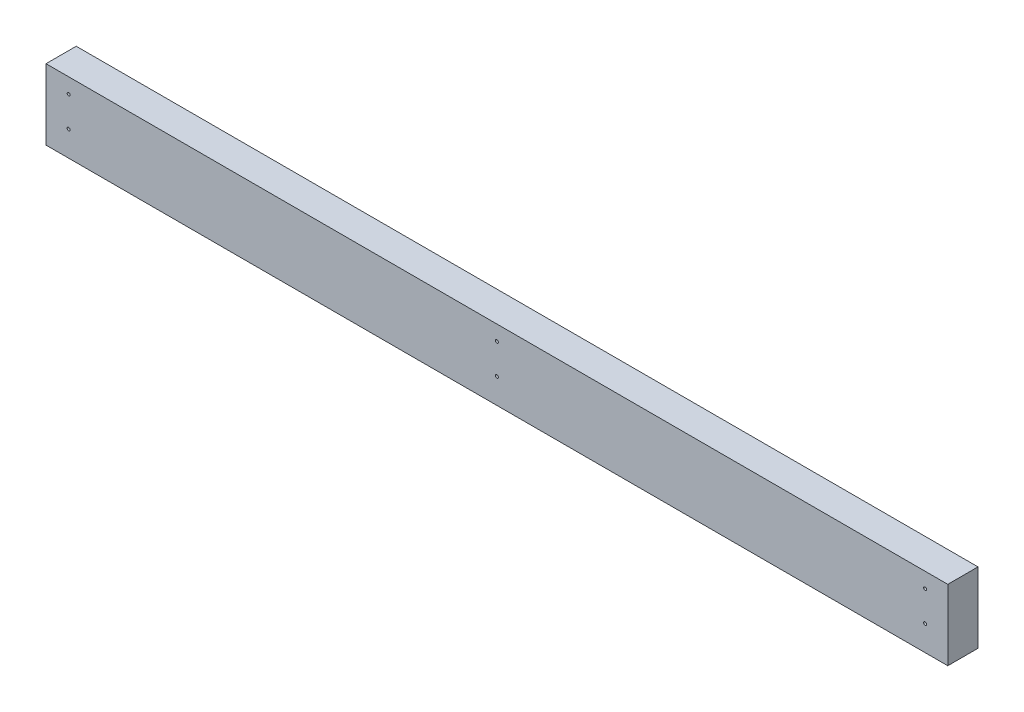
ISO-10303-21;
HEADER;
FILE_DESCRIPTION(('STEP AP214'),'2;1');
FILE_NAME('part.step','',(''),(''),'','','');
FILE_SCHEMA(('AUTOMOTIVE_DESIGN { 1 0 10303 214 1 1 1 1 }'));
ENDSEC;
DATA;
#1=APPLICATION_CONTEXT('core data for automotive mechanical design processes');
#2=APPLICATION_PROTOCOL_DEFINITION('international standard','automotive_design',2000,#1);
#3=PRODUCT_CONTEXT('',#1,'mechanical');
#4=PRODUCT('Part','Part','',(#3));
#5=PRODUCT_RELATED_PRODUCT_CATEGORY('part','',(#4));
#6=PRODUCT_DEFINITION_FORMATION('','',#4);
#7=PRODUCT_DEFINITION_CONTEXT('part definition',#1,'design');
#8=PRODUCT_DEFINITION('design','',#6,#7);
#9=PRODUCT_DEFINITION_SHAPE('','',#8);
#10=(LENGTH_UNIT() NAMED_UNIT(*) SI_UNIT(.MILLI.,.METRE.));
#11=(NAMED_UNIT(*) PLANE_ANGLE_UNIT() SI_UNIT($,.RADIAN.));
#12=(NAMED_UNIT(*) SI_UNIT($,.STERADIAN.) SOLID_ANGLE_UNIT());
#13=UNCERTAINTY_MEASURE_WITH_UNIT(LENGTH_MEASURE(1.E-05),#10,'distance_accuracy_value','');
#14=(GEOMETRIC_REPRESENTATION_CONTEXT(3) GLOBAL_UNCERTAINTY_ASSIGNED_CONTEXT((#13)) GLOBAL_UNIT_ASSIGNED_CONTEXT((#10,
#11,#12)) REPRESENTATION_CONTEXT('',''));
#15=CARTESIAN_POINT('',(0.,0.,0.));
#16=DIRECTION('',(0.,0.,1.));
#17=DIRECTION('',(1.,0.,0.));
#18=AXIS2_PLACEMENT_3D('',#15,#16,#17);
#19=CARTESIAN_POINT('',(-568.325,0.,1028.7));
#20=DIRECTION('',(0.,0.,1.));
#21=DIRECTION('',(1.,0.,0.));
#22=AXIS2_PLACEMENT_3D('',#19,#20,#21);
#23=PLANE('',#22);
#24=CARTESIAN_POINT('',(539.75,-431.8,1028.7));
#25=DIRECTION('',(0.,0.,-1.));
#26=DIRECTION('',(-1.,0.,0.));
#27=AXIS2_PLACEMENT_3D('',#24,#25,#26);
#28=CIRCLE('',#27,1.905);
#29=CARTESIAN_POINT('',(537.845,-431.8,1028.7));
#30=VERTEX_POINT('',#29);
#31=EDGE_CURVE('E95',#30,#30,#28,.F.);
#32=ORIENTED_EDGE('',*,*,#31,.T.);
#33=EDGE_LOOP('',(#32));
#34=FACE_BOUND('',#33,.T.);
#35=CARTESIAN_POINT('',(539.75,-469.9,1028.7));
#36=DIRECTION('',(0.,0.,-1.));
#37=DIRECTION('',(-1.,0.,0.));
#38=AXIS2_PLACEMENT_3D('',#35,#36,#37);
#39=CIRCLE('',#38,1.905);
#40=CARTESIAN_POINT('',(537.845,-469.9,1028.7));
#41=VERTEX_POINT('',#40);
#42=EDGE_CURVE('E99',#41,#41,#39,.F.);
#43=ORIENTED_EDGE('',*,*,#42,.T.);
#44=EDGE_LOOP('',(#43));
#45=FACE_BOUND('',#44,.T.);
#46=CARTESIAN_POINT('',(-539.75,-469.9,1028.7));
#47=DIRECTION('',(0.,0.,-1.));
#48=DIRECTION('',(-1.,0.,0.));
#49=AXIS2_PLACEMENT_3D('',#46,#47,#48);
#50=CIRCLE('',#49,1.905);
#51=CARTESIAN_POINT('',(-541.655,-469.9,1028.7));
#52=VERTEX_POINT('',#51);
#53=EDGE_CURVE('E102',#52,#52,#50,.F.);
#54=ORIENTED_EDGE('',*,*,#53,.T.);
#55=EDGE_LOOP('',(#54));
#56=FACE_BOUND('',#55,.T.);
#57=CARTESIAN_POINT('',(-539.75,-431.8,1028.7));
#58=DIRECTION('',(0.,0.,-1.));
#59=DIRECTION('',(-1.,0.,0.));
#60=AXIS2_PLACEMENT_3D('',#57,#58,#59);
#61=CIRCLE('',#60,1.905);
#62=CARTESIAN_POINT('',(-541.655,-431.8,1028.7));
#63=VERTEX_POINT('',#62);
#64=EDGE_CURVE('E105',#63,#63,#61,.F.);
#65=ORIENTED_EDGE('',*,*,#64,.T.);
#66=EDGE_LOOP('',(#65));
#67=FACE_BOUND('',#66,.T.);
#68=CARTESIAN_POINT('',(0.,-469.9,1028.7));
#69=DIRECTION('',(0.,0.,-1.));
#70=DIRECTION('',(-1.,0.,0.));
#71=AXIS2_PLACEMENT_3D('',#68,#69,#70);
#72=CIRCLE('',#71,1.905);
#73=CARTESIAN_POINT('',(-1.905,-469.9,1028.7));
#74=VERTEX_POINT('',#73);
#75=EDGE_CURVE('E107',#74,#74,#72,.F.);
#76=ORIENTED_EDGE('',*,*,#75,.T.);
#77=EDGE_LOOP('',(#76));
#78=FACE_BOUND('',#77,.T.);
#79=CARTESIAN_POINT('',(0.,-431.8,1028.7));
#80=DIRECTION('',(0.,0.,-1.));
#81=DIRECTION('',(-1.,0.,0.));
#82=AXIS2_PLACEMENT_3D('',#79,#80,#81);
#83=CIRCLE('',#82,1.905);
#84=CARTESIAN_POINT('',(-1.905,-431.8,1028.7));
#85=VERTEX_POINT('',#84);
#86=EDGE_CURVE('E19',#85,#85,#83,.F.);
#87=ORIENTED_EDGE('',*,*,#86,.T.);
#88=EDGE_LOOP('',(#87));
#89=FACE_BOUND('',#88,.T.);
#90=DIRECTION('',(1.,0.,0.));
#91=VECTOR('',#90,1.);
#92=CARTESIAN_POINT('',(568.325,-412.75,1028.7));
#93=LINE('',#92,#91);
#94=CARTESIAN_POINT('',(568.325,-412.75,1028.7));
#95=VERTEX_POINT('',#94);
#96=CARTESIAN_POINT('',(-568.325,-412.75,1028.7));
#97=VERTEX_POINT('',#96);
#98=EDGE_CURVE('E54',#95,#97,#93,.F.);
#99=ORIENTED_EDGE('',*,*,#98,.F.);
#100=DIRECTION('',(0.,1.,0.));
#101=VECTOR('',#100,1.);
#102=CARTESIAN_POINT('',(568.325,-501.65,1028.7));
#103=LINE('',#102,#101);
#104=CARTESIAN_POINT('',(568.325,-501.65,1028.7));
#105=VERTEX_POINT('',#104);
#106=EDGE_CURVE('E59',#105,#95,#103,.T.);
#107=ORIENTED_EDGE('',*,*,#106,.F.);
#108=DIRECTION('',(1.,0.,0.));
#109=VECTOR('',#108,1.);
#110=CARTESIAN_POINT('',(-568.325,-501.65,1028.7));
#111=LINE('',#110,#109);
#112=CARTESIAN_POINT('',(-568.325,-501.65,1028.7));
#113=VERTEX_POINT('',#112);
#114=EDGE_CURVE('E114',#113,#105,#111,.T.);
#115=ORIENTED_EDGE('',*,*,#114,.F.);
#116=DIRECTION('',(0.,1.,0.));
#117=VECTOR('',#116,1.);
#118=CARTESIAN_POINT('',(-568.325,-412.75,1028.7));
#119=LINE('',#118,#117);
#120=EDGE_CURVE('E69',#97,#113,#119,.F.);
#121=ORIENTED_EDGE('',*,*,#120,.F.);
#122=EDGE_LOOP('',(#99,#107,#115,#121));
#123=FACE_BOUND('',#122,.T.);
#124=ADVANCED_FACE('F16',(#34,#45,#56,#67,#78,#89,#123),#23,.F.);
#125=CARTESIAN_POINT('',(568.325,-501.65,1066.8));
#126=DIRECTION('',(1.,0.,0.));
#127=DIRECTION('',(0.,0.,-1.));
#128=AXIS2_PLACEMENT_3D('',#125,#126,#127);
#129=PLANE('',#128);
#130=DIRECTION('',(0.,0.,1.));
#131=VECTOR('',#130,1.);
#132=CARTESIAN_POINT('',(568.325,-412.75,1066.8));
#133=LINE('',#132,#131);
#134=CARTESIAN_POINT('',(568.325,-412.75,1066.8));
#135=VERTEX_POINT('',#134);
#136=EDGE_CURVE('E61',#135,#95,#133,.F.);
#137=ORIENTED_EDGE('',*,*,#136,.F.);
#138=DIRECTION('',(0.,1.,0.));
#139=VECTOR('',#138,1.);
#140=CARTESIAN_POINT('',(568.325,0.,1066.8));
#141=LINE('',#140,#139);
#142=CARTESIAN_POINT('',(568.325,-501.65,1066.8));
#143=VERTEX_POINT('',#142);
#144=EDGE_CURVE('E98',#143,#135,#141,.T.);
#145=ORIENTED_EDGE('',*,*,#144,.F.);
#146=DIRECTION('',(0.,0.,-1.));
#147=VECTOR('',#146,1.);
#148=CARTESIAN_POINT('',(568.325,-501.65,1066.8));
#149=LINE('',#148,#147);
#150=EDGE_CURVE('E64',#105,#143,#149,.F.);
#151=ORIENTED_EDGE('',*,*,#150,.F.);
#152=ORIENTED_EDGE('',*,*,#106,.T.);
#153=EDGE_LOOP('',(#137,#145,#151,#152));
#154=FACE_BOUND('',#153,.T.);
#155=ADVANCED_FACE('F60',(#154),#129,.T.);
#156=CARTESIAN_POINT('',(568.325,-412.75,1066.8));
#157=DIRECTION('',(0.,1.,0.));
#158=DIRECTION('',(0.,0.,1.));
#159=AXIS2_PLACEMENT_3D('',#156,#157,#158);
#160=PLANE('',#159);
#161=DIRECTION('',(0.,0.,1.));
#162=VECTOR('',#161,1.);
#163=CARTESIAN_POINT('',(-568.325,-412.75,1066.8));
#164=LINE('',#163,#162);
#165=CARTESIAN_POINT('',(-568.325,-412.75,1066.8));
#166=VERTEX_POINT('',#165);
#167=EDGE_CURVE('E71',#166,#97,#164,.F.);
#168=ORIENTED_EDGE('',*,*,#167,.F.);
#169=DIRECTION('',(1.,0.,0.));
#170=VECTOR('',#169,1.);
#171=CARTESIAN_POINT('',(-568.325,-412.75,1066.8));
#172=LINE('',#171,#170);
#173=EDGE_CURVE('E75',#135,#166,#172,.F.);
#174=ORIENTED_EDGE('',*,*,#173,.F.);
#175=ORIENTED_EDGE('',*,*,#136,.T.);
#176=ORIENTED_EDGE('',*,*,#98,.T.);
#177=EDGE_LOOP('',(#168,#174,#175,#176));
#178=FACE_BOUND('',#177,.T.);
#179=ADVANCED_FACE('F73',(#178),#160,.T.);
#180=CARTESIAN_POINT('',(-568.325,-412.75,1066.8));
#181=DIRECTION('',(-1.,0.,0.));
#182=DIRECTION('',(0.,0.,1.));
#183=AXIS2_PLACEMENT_3D('',#180,#181,#182);
#184=PLANE('',#183);
#185=DIRECTION('',(0.,0.,-1.));
#186=VECTOR('',#185,1.);
#187=CARTESIAN_POINT('',(-568.325,-501.65,1066.8));
#188=LINE('',#187,#186);
#189=CARTESIAN_POINT('',(-568.325,-501.65,1066.8));
#190=VERTEX_POINT('',#189);
#191=EDGE_CURVE('E34',#190,#113,#188,.T.);
#192=ORIENTED_EDGE('',*,*,#191,.F.);
#193=DIRECTION('',(0.,1.,0.));
#194=VECTOR('',#193,1.);
#195=CARTESIAN_POINT('',(-568.325,0.,1066.8));
#196=LINE('',#195,#194);
#197=EDGE_CURVE('E125',#166,#190,#196,.F.);
#198=ORIENTED_EDGE('',*,*,#197,.F.);
#199=ORIENTED_EDGE('',*,*,#167,.T.);
#200=ORIENTED_EDGE('',*,*,#120,.T.);
#201=EDGE_LOOP('',(#192,#198,#199,#200));
#202=FACE_BOUND('',#201,.T.);
#203=ADVANCED_FACE('F123',(#202),#184,.T.);
#204=CARTESIAN_POINT('',(-568.325,-501.65,1066.8));
#205=DIRECTION('',(0.,-1.,0.));
#206=DIRECTION('',(0.,0.,-1.));
#207=AXIS2_PLACEMENT_3D('',#204,#205,#206);
#208=PLANE('',#207);
#209=ORIENTED_EDGE('',*,*,#150,.T.);
#210=DIRECTION('',(1.,0.,0.));
#211=VECTOR('',#210,1.);
#212=CARTESIAN_POINT('',(-568.325,-501.65,1066.8));
#213=LINE('',#212,#211);
#214=EDGE_CURVE('E94',#190,#143,#213,.T.);
#215=ORIENTED_EDGE('',*,*,#214,.F.);
#216=ORIENTED_EDGE('',*,*,#191,.T.);
#217=ORIENTED_EDGE('',*,*,#114,.T.);
#218=EDGE_LOOP('',(#209,#215,#216,#217));
#219=FACE_BOUND('',#218,.T.);
#220=ADVANCED_FACE('F130',(#219),#208,.T.);
#221=CARTESIAN_POINT('',(0.,-431.8,1028.7));
#222=DIRECTION('',(0.,0.,-1.));
#223=DIRECTION('',(-1.,0.,0.));
#224=AXIS2_PLACEMENT_3D('',#221,#222,#223);
#225=CYLINDRICAL_SURFACE('',#224,1.905);
#226=ORIENTED_EDGE('',*,*,#86,.F.);
#227=EDGE_LOOP('',(#226));
#228=FACE_BOUND('',#227,.T.);
#229=CARTESIAN_POINT('',(0.,-431.8,1066.8));
#230=DIRECTION('',(0.,0.,-1.));
#231=DIRECTION('',(-1.,0.,0.));
#232=AXIS2_PLACEMENT_3D('',#229,#230,#231);
#233=CIRCLE('',#232,1.905);
#234=CARTESIAN_POINT('',(-1.905,-431.8,1066.8));
#235=VERTEX_POINT('',#234);
#236=EDGE_CURVE('E91',#235,#235,#233,.T.);
#237=ORIENTED_EDGE('',*,*,#236,.F.);
#238=EDGE_LOOP('',(#237));
#239=FACE_BOUND('',#238,.T.);
#240=ADVANCED_FACE('F132',(#228,#239),#225,.F.);
#241=CARTESIAN_POINT('',(0.,-469.9,1028.7));
#242=DIRECTION('',(0.,0.,-1.));
#243=DIRECTION('',(-1.,0.,0.));
#244=AXIS2_PLACEMENT_3D('',#241,#242,#243);
#245=CYLINDRICAL_SURFACE('',#244,1.905);
#246=ORIENTED_EDGE('',*,*,#75,.F.);
#247=EDGE_LOOP('',(#246));
#248=FACE_BOUND('',#247,.T.);
#249=CARTESIAN_POINT('',(0.,-469.9,1066.8));
#250=DIRECTION('',(0.,0.,-1.));
#251=DIRECTION('',(-1.,0.,0.));
#252=AXIS2_PLACEMENT_3D('',#249,#250,#251);
#253=CIRCLE('',#252,1.905);
#254=CARTESIAN_POINT('',(-1.905,-469.9,1066.8));
#255=VERTEX_POINT('',#254);
#256=EDGE_CURVE('E88',#255,#255,#253,.T.);
#257=ORIENTED_EDGE('',*,*,#256,.F.);
#258=EDGE_LOOP('',(#257));
#259=FACE_BOUND('',#258,.T.);
#260=ADVANCED_FACE('F139',(#248,#259),#245,.F.);
#261=CARTESIAN_POINT('',(-539.75,-431.8,1028.7));
#262=DIRECTION('',(0.,0.,-1.));
#263=DIRECTION('',(-1.,0.,0.));
#264=AXIS2_PLACEMENT_3D('',#261,#262,#263);
#265=CYLINDRICAL_SURFACE('',#264,1.905);
#266=ORIENTED_EDGE('',*,*,#64,.F.);
#267=EDGE_LOOP('',(#266));
#268=FACE_BOUND('',#267,.T.);
#269=CARTESIAN_POINT('',(-539.75,-431.8,1066.8));
#270=DIRECTION('',(0.,0.,-1.));
#271=DIRECTION('',(-1.,0.,0.));
#272=AXIS2_PLACEMENT_3D('',#269,#270,#271);
#273=CIRCLE('',#272,1.905);
#274=CARTESIAN_POINT('',(-541.655,-431.8,1066.8));
#275=VERTEX_POINT('',#274);
#276=EDGE_CURVE('E85',#275,#275,#273,.T.);
#277=ORIENTED_EDGE('',*,*,#276,.F.);
#278=EDGE_LOOP('',(#277));
#279=FACE_BOUND('',#278,.T.);
#280=ADVANCED_FACE('F161',(#268,#279),#265,.F.);
#281=CARTESIAN_POINT('',(-539.75,-469.9,1028.7));
#282=DIRECTION('',(0.,0.,-1.));
#283=DIRECTION('',(-1.,0.,0.));
#284=AXIS2_PLACEMENT_3D('',#281,#282,#283);
#285=CYLINDRICAL_SURFACE('',#284,1.905);
#286=ORIENTED_EDGE('',*,*,#53,.F.);
#287=EDGE_LOOP('',(#286));
#288=FACE_BOUND('',#287,.T.);
#289=CARTESIAN_POINT('',(-539.75,-469.9,1066.8));
#290=DIRECTION('',(0.,0.,-1.));
#291=DIRECTION('',(-1.,0.,0.));
#292=AXIS2_PLACEMENT_3D('',#289,#290,#291);
#293=CIRCLE('',#292,1.905);
#294=CARTESIAN_POINT('',(-541.655,-469.9,1066.8));
#295=VERTEX_POINT('',#294);
#296=EDGE_CURVE('E82',#295,#295,#293,.T.);
#297=ORIENTED_EDGE('',*,*,#296,.F.);
#298=EDGE_LOOP('',(#297));
#299=FACE_BOUND('',#298,.T.);
#300=ADVANCED_FACE('F157',(#288,#299),#285,.F.);
#301=CARTESIAN_POINT('',(539.75,-469.9,1028.7));
#302=DIRECTION('',(0.,0.,-1.));
#303=DIRECTION('',(-1.,0.,0.));
#304=AXIS2_PLACEMENT_3D('',#301,#302,#303);
#305=CYLINDRICAL_SURFACE('',#304,1.905);
#306=ORIENTED_EDGE('',*,*,#42,.F.);
#307=EDGE_LOOP('',(#306));
#308=FACE_BOUND('',#307,.T.);
#309=CARTESIAN_POINT('',(539.75,-469.9,1066.8));
#310=DIRECTION('',(0.,0.,-1.));
#311=DIRECTION('',(-1.,0.,0.));
#312=AXIS2_PLACEMENT_3D('',#309,#310,#311);
#313=CIRCLE('',#312,1.905);
#314=CARTESIAN_POINT('',(537.845,-469.9,1066.8));
#315=VERTEX_POINT('',#314);
#316=EDGE_CURVE('E25',#315,#315,#313,.T.);
#317=ORIENTED_EDGE('',*,*,#316,.F.);
#318=EDGE_LOOP('',(#317));
#319=FACE_BOUND('',#318,.T.);
#320=ADVANCED_FACE('F150',(#308,#319),#305,.F.);
#321=CARTESIAN_POINT('',(539.75,-431.8,1028.7));
#322=DIRECTION('',(0.,0.,-1.));
#323=DIRECTION('',(-1.,0.,0.));
#324=AXIS2_PLACEMENT_3D('',#321,#322,#323);
#325=CYLINDRICAL_SURFACE('',#324,1.905);
#326=ORIENTED_EDGE('',*,*,#31,.F.);
#327=EDGE_LOOP('',(#326));
#328=FACE_BOUND('',#327,.T.);
#329=CARTESIAN_POINT('',(539.75,-431.8,1066.8));
#330=DIRECTION('',(0.,0.,-1.));
#331=DIRECTION('',(-1.,0.,0.));
#332=AXIS2_PLACEMENT_3D('',#329,#330,#331);
#333=CIRCLE('',#332,1.905);
#334=CARTESIAN_POINT('',(537.845,-431.8,1066.8));
#335=VERTEX_POINT('',#334);
#336=EDGE_CURVE('E11',#335,#335,#333,.T.);
#337=ORIENTED_EDGE('',*,*,#336,.F.);
#338=EDGE_LOOP('',(#337));
#339=FACE_BOUND('',#338,.T.);
#340=ADVANCED_FACE('F144',(#328,#339),#325,.F.);
#341=CARTESIAN_POINT('',(-568.325,0.,1066.8));
#342=DIRECTION('',(0.,0.,1.));
#343=DIRECTION('',(1.,0.,0.));
#344=AXIS2_PLACEMENT_3D('',#341,#342,#343);
#345=PLANE('',#344);
#346=ORIENTED_EDGE('',*,*,#336,.T.);
#347=EDGE_LOOP('',(#346));
#348=FACE_BOUND('',#347,.T.);
#349=ORIENTED_EDGE('',*,*,#316,.T.);
#350=EDGE_LOOP('',(#349));
#351=FACE_BOUND('',#350,.T.);
#352=ORIENTED_EDGE('',*,*,#296,.T.);
#353=EDGE_LOOP('',(#352));
#354=FACE_BOUND('',#353,.T.);
#355=ORIENTED_EDGE('',*,*,#276,.T.);
#356=EDGE_LOOP('',(#355));
#357=FACE_BOUND('',#356,.T.);
#358=ORIENTED_EDGE('',*,*,#256,.T.);
#359=EDGE_LOOP('',(#358));
#360=FACE_BOUND('',#359,.T.);
#361=ORIENTED_EDGE('',*,*,#236,.T.);
#362=EDGE_LOOP('',(#361));
#363=FACE_BOUND('',#362,.T.);
#364=ORIENTED_EDGE('',*,*,#197,.T.);
#365=ORIENTED_EDGE('',*,*,#214,.T.);
#366=ORIENTED_EDGE('',*,*,#144,.T.);
#367=ORIENTED_EDGE('',*,*,#173,.T.);
#368=EDGE_LOOP('',(#364,#365,#366,#367));
#369=FACE_BOUND('',#368,.T.);
#370=ADVANCED_FACE('F128',(#348,#351,#354,#357,#360,#363,#369),#345,.T.);
#371=CLOSED_SHELL('',(#124,#155,#179,#203,#220,#240,#260,#280,#300,#320,#340,#370));
#372=MANIFOLD_SOLID_BREP('B1',#371);
#373=ADVANCED_BREP_SHAPE_REPRESENTATION('',(#18,#372),#14);
#374=SHAPE_DEFINITION_REPRESENTATION(#9,#373);
ENDSEC;
END-ISO-10303-21;
